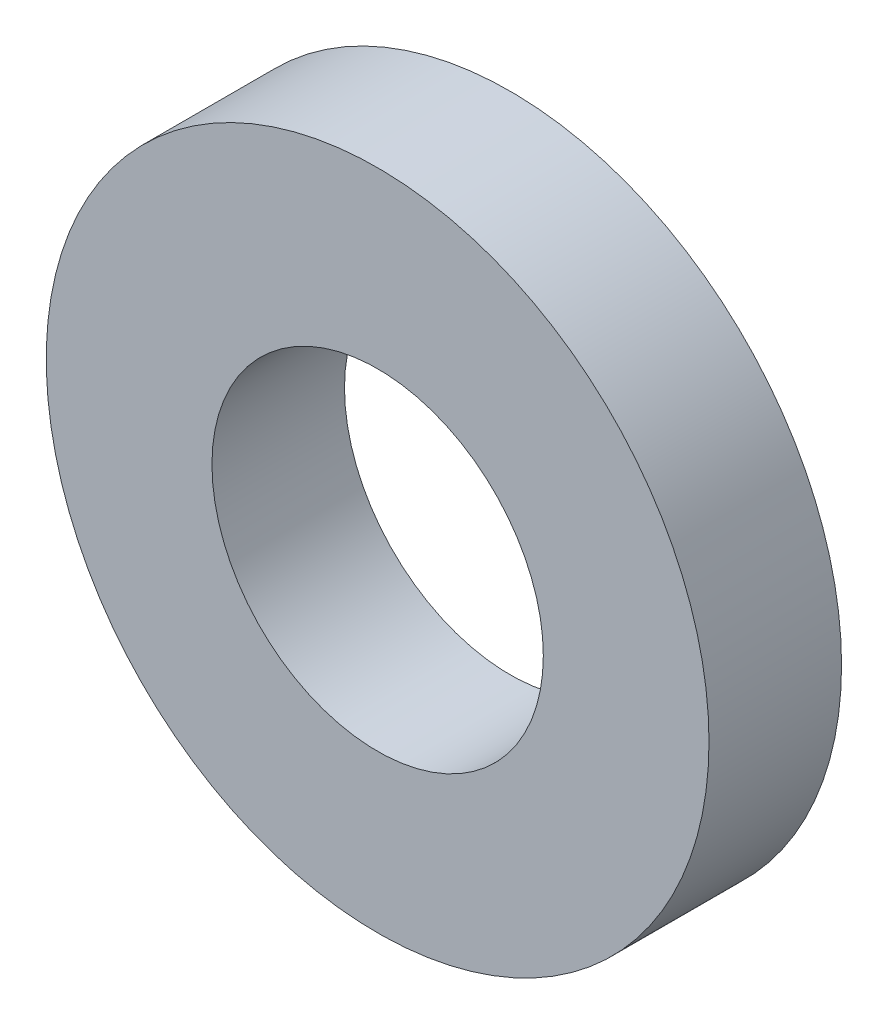
ISO-10303-21;
HEADER;
FILE_DESCRIPTION(('STEP AP214'),'2;1');
FILE_NAME('part.step','',(''),(''),'','','');
FILE_SCHEMA(('AUTOMOTIVE_DESIGN { 1 0 10303 214 1 1 1 1 }'));
ENDSEC;
DATA;
#1=APPLICATION_CONTEXT('core data for automotive mechanical design processes');
#2=APPLICATION_PROTOCOL_DEFINITION('international standard','automotive_design',2000,#1);
#3=PRODUCT_CONTEXT('',#1,'mechanical');
#4=PRODUCT('Part','Part','',(#3));
#5=PRODUCT_RELATED_PRODUCT_CATEGORY('part','',(#4));
#6=PRODUCT_DEFINITION_FORMATION('','',#4);
#7=PRODUCT_DEFINITION_CONTEXT('part definition',#1,'design');
#8=PRODUCT_DEFINITION('design','',#6,#7);
#9=PRODUCT_DEFINITION_SHAPE('','',#8);
#10=(LENGTH_UNIT() NAMED_UNIT(*) SI_UNIT(.MILLI.,.METRE.));
#11=(NAMED_UNIT(*) PLANE_ANGLE_UNIT() SI_UNIT($,.RADIAN.));
#12=(NAMED_UNIT(*) SI_UNIT($,.STERADIAN.) SOLID_ANGLE_UNIT());
#13=UNCERTAINTY_MEASURE_WITH_UNIT(LENGTH_MEASURE(1.E-05),#10,'distance_accuracy_value','');
#14=(GEOMETRIC_REPRESENTATION_CONTEXT(3) GLOBAL_UNCERTAINTY_ASSIGNED_CONTEXT((#13)) GLOBAL_UNIT_ASSIGNED_CONTEXT((#10,
#11,#12)) REPRESENTATION_CONTEXT('',''));
#15=CARTESIAN_POINT('',(0.,0.,0.));
#16=DIRECTION('',(0.,0.,1.));
#17=DIRECTION('',(1.,0.,0.));
#18=AXIS2_PLACEMENT_3D('',#15,#16,#17);
#19=CARTESIAN_POINT('',(0.,0.,6.35));
#20=DIRECTION('',(0.,0.,1.));
#21=DIRECTION('',(1.,0.,0.));
#22=AXIS2_PLACEMENT_3D('',#19,#20,#21);
#23=PLANE('',#22);
#24=CARTESIAN_POINT('',(0.,0.,6.35));
#25=DIRECTION('',(0.,0.,1.));
#26=DIRECTION('',(1.,0.,0.));
#27=AXIS2_PLACEMENT_3D('',#24,#25,#26);
#28=CIRCLE('',#27,15.875);
#29=CARTESIAN_POINT('',(15.875,0.,6.35));
#30=VERTEX_POINT('',#29);
#31=EDGE_CURVE('E10',#30,#30,#28,.T.);
#32=ORIENTED_EDGE('',*,*,#31,.T.);
#33=EDGE_LOOP('',(#32));
#34=FACE_BOUND('',#33,.T.);
#35=CARTESIAN_POINT('',(0.,-0.40368205327997,6.35));
#36=DIRECTION('',(0.,0.,1.));
#37=DIRECTION('',(1.,0.,0.));
#38=AXIS2_PLACEMENT_3D('',#35,#36,#37);
#39=CIRCLE('',#38,7.9375);
#40=CARTESIAN_POINT('',(7.9375,-0.40368205327997,6.35));
#41=VERTEX_POINT('',#40);
#42=EDGE_CURVE('E46',#41,#41,#39,.T.);
#43=ORIENTED_EDGE('',*,*,#42,.F.);
#44=EDGE_LOOP('',(#43));
#45=FACE_BOUND('',#44,.T.);
#46=ADVANCED_FACE('F35',(#34,#45),#23,.T.);
#47=CARTESIAN_POINT('',(0.,0.,0.));
#48=DIRECTION('',(0.,0.,1.));
#49=DIRECTION('',(1.,0.,0.));
#50=AXIS2_PLACEMENT_3D('',#47,#48,#49);
#51=PLANE('',#50);
#52=CARTESIAN_POINT('',(0.,0.,0.));
#53=DIRECTION('',(0.,0.,1.));
#54=DIRECTION('',(1.,0.,0.));
#55=AXIS2_PLACEMENT_3D('',#52,#53,#54);
#56=CIRCLE('',#55,15.875);
#57=CARTESIAN_POINT('',(15.875,0.,0.));
#58=VERTEX_POINT('',#57);
#59=EDGE_CURVE('E39',#58,#58,#56,.T.);
#60=ORIENTED_EDGE('',*,*,#59,.F.);
#61=EDGE_LOOP('',(#60));
#62=FACE_BOUND('',#61,.T.);
#63=CARTESIAN_POINT('',(0.,-0.40368205327997,0.));
#64=DIRECTION('',(0.,0.,1.));
#65=DIRECTION('',(1.,0.,0.));
#66=AXIS2_PLACEMENT_3D('',#63,#64,#65);
#67=CIRCLE('',#66,7.9375);
#68=CARTESIAN_POINT('',(7.9375,-0.40368205327997,0.));
#69=VERTEX_POINT('',#68);
#70=EDGE_CURVE('E48',#69,#69,#67,.T.);
#71=ORIENTED_EDGE('',*,*,#70,.T.);
#72=EDGE_LOOP('',(#71));
#73=FACE_BOUND('',#72,.T.);
#74=ADVANCED_FACE('F58',(#62,#73),#51,.F.);
#75=CARTESIAN_POINT('',(0.,0.,6.35));
#76=DIRECTION('',(0.,0.,-1.));
#77=DIRECTION('',(-1.,0.,0.));
#78=AXIS2_PLACEMENT_3D('',#75,#76,#77);
#79=CYLINDRICAL_SURFACE('',#78,15.875);
#80=ORIENTED_EDGE('',*,*,#31,.F.);
#81=EDGE_LOOP('',(#80));
#82=FACE_BOUND('',#81,.T.);
#83=ORIENTED_EDGE('',*,*,#59,.T.);
#84=EDGE_LOOP('',(#83));
#85=FACE_BOUND('',#84,.T.);
#86=ADVANCED_FACE('F37',(#82,#85),#79,.T.);
#87=CARTESIAN_POINT('',(0.,-0.40368205327997,6.35));
#88=DIRECTION('',(0.,0.,-1.));
#89=DIRECTION('',(-1.,0.,0.));
#90=AXIS2_PLACEMENT_3D('',#87,#88,#89);
#91=CYLINDRICAL_SURFACE('',#90,7.9375);
#92=ORIENTED_EDGE('',*,*,#42,.T.);
#93=EDGE_LOOP('',(#92));
#94=FACE_BOUND('',#93,.T.);
#95=ORIENTED_EDGE('',*,*,#70,.F.);
#96=EDGE_LOOP('',(#95));
#97=FACE_BOUND('',#96,.T.);
#98=ADVANCED_FACE('F54',(#94,#97),#91,.F.);
#99=CLOSED_SHELL('',(#46,#74,#86,#98));
#100=MANIFOLD_SOLID_BREP('B2',#99);
#101=ADVANCED_BREP_SHAPE_REPRESENTATION('',(#18,#100),#14);
#102=SHAPE_DEFINITION_REPRESENTATION(#9,#101);
ENDSEC;
END-ISO-10303-21;
